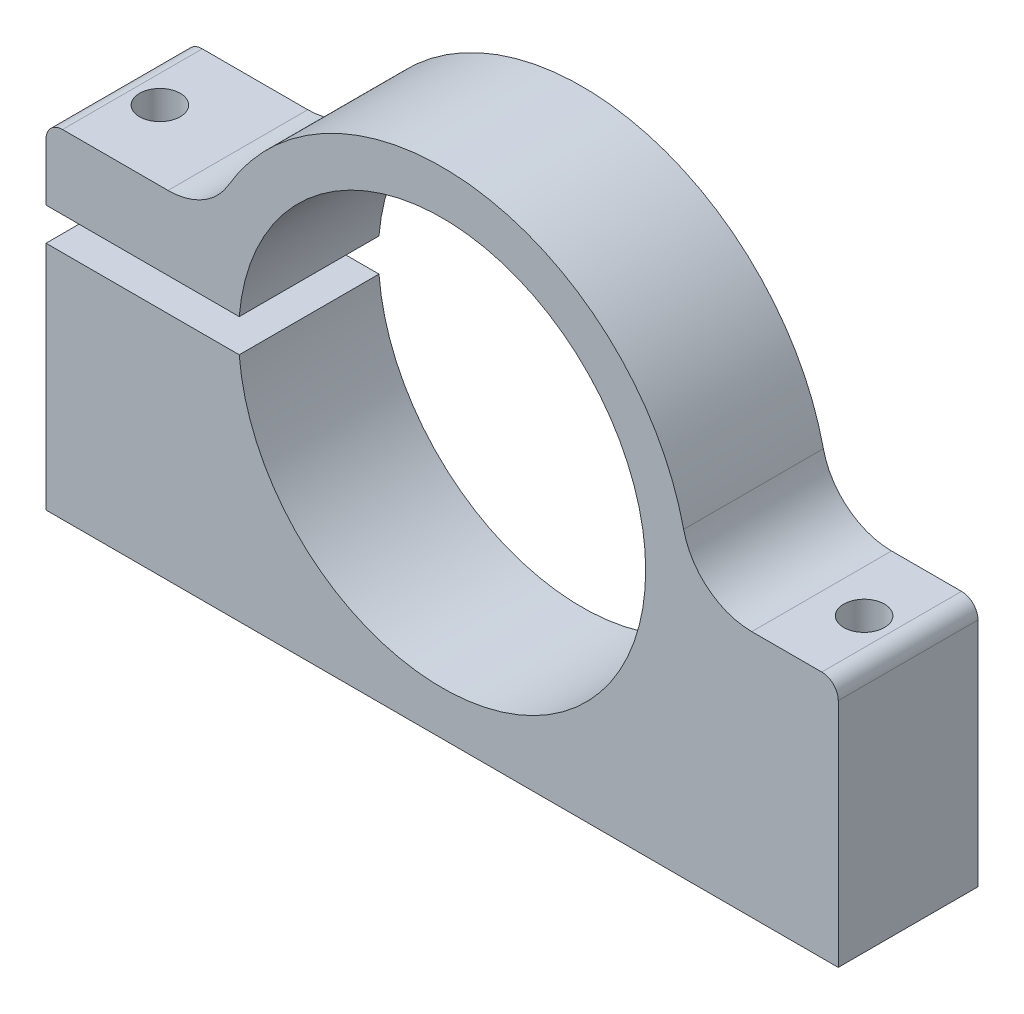
ISO-10303-21;
HEADER;
FILE_DESCRIPTION(('STEP AP214'),'2;1');
FILE_NAME('part.step','',(''),(''),'','','');
FILE_SCHEMA(('AUTOMOTIVE_DESIGN { 1 0 10303 214 1 1 1 1 }'));
ENDSEC;
DATA;
#1=APPLICATION_CONTEXT('core data for automotive mechanical design processes');
#2=APPLICATION_PROTOCOL_DEFINITION('international standard','automotive_design',2000,#1);
#3=PRODUCT_CONTEXT('',#1,'mechanical');
#4=PRODUCT('Part','Part','',(#3));
#5=PRODUCT_RELATED_PRODUCT_CATEGORY('part','',(#4));
#6=PRODUCT_DEFINITION_FORMATION('','',#4);
#7=PRODUCT_DEFINITION_CONTEXT('part definition',#1,'design');
#8=PRODUCT_DEFINITION('design','',#6,#7);
#9=PRODUCT_DEFINITION_SHAPE('','',#8);
#10=(LENGTH_UNIT() NAMED_UNIT(*) SI_UNIT(.MILLI.,.METRE.));
#11=(NAMED_UNIT(*) PLANE_ANGLE_UNIT() SI_UNIT($,.RADIAN.));
#12=(NAMED_UNIT(*) SI_UNIT($,.STERADIAN.) SOLID_ANGLE_UNIT());
#13=UNCERTAINTY_MEASURE_WITH_UNIT(LENGTH_MEASURE(1.E-05),#10,'distance_accuracy_value','');
#14=(GEOMETRIC_REPRESENTATION_CONTEXT(3) GLOBAL_UNCERTAINTY_ASSIGNED_CONTEXT((#13)) GLOBAL_UNIT_ASSIGNED_CONTEXT((#10,
#11,#12)) REPRESENTATION_CONTEXT('',''));
#15=CARTESIAN_POINT('',(0.,0.,0.));
#16=DIRECTION('',(0.,0.,1.));
#17=DIRECTION('',(1.,0.,0.));
#18=AXIS2_PLACEMENT_3D('',#15,#16,#17);
#19=CARTESIAN_POINT('',(-36.,8.2,-6.35));
#20=DIRECTION('',(-1.,0.,0.));
#21=DIRECTION('',(0.,0.,1.));
#22=AXIS2_PLACEMENT_3D('',#19,#20,#21);
#23=PLANE('',#22);
#24=DIRECTION('',(0.,0.,-1.));
#25=VECTOR('',#24,1.);
#26=CARTESIAN_POINT('',(-36.,-1.5,6.35));
#27=LINE('',#26,#25);
#28=CARTESIAN_POINT('',(-36.,-1.5,6.35));
#29=VERTEX_POINT('',#28);
#30=CARTESIAN_POINT('',(-36.,-1.5,-6.35));
#31=VERTEX_POINT('',#30);
#32=EDGE_CURVE('E142',#29,#31,#27,.T.);
#33=ORIENTED_EDGE('',*,*,#32,.T.);
#34=DIRECTION('',(0.,-1.,0.));
#35=VECTOR('',#34,1.);
#36=CARTESIAN_POINT('',(-36.,8.2,-6.35));
#37=LINE('',#36,#35);
#38=CARTESIAN_POINT('',(-36.,-22.5,-6.35));
#39=VERTEX_POINT('',#38);
#40=EDGE_CURVE('E179',#31,#39,#37,.T.);
#41=ORIENTED_EDGE('',*,*,#40,.T.);
#42=DIRECTION('',(0.,0.,1.));
#43=VECTOR('',#42,1.);
#44=CARTESIAN_POINT('',(-36.,-22.5,-6.35));
#45=LINE('',#44,#43);
#46=CARTESIAN_POINT('',(-36.,-22.5,6.35));
#47=VERTEX_POINT('',#46);
#48=EDGE_CURVE('E190',#39,#47,#45,.T.);
#49=ORIENTED_EDGE('',*,*,#48,.T.);
#50=DIRECTION('',(0.,-1.,0.));
#51=VECTOR('',#50,1.);
#52=CARTESIAN_POINT('',(-36.,8.2,6.35));
#53=LINE('',#52,#51);
#54=EDGE_CURVE('E194',#29,#47,#53,.T.);
#55=ORIENTED_EDGE('',*,*,#54,.F.);
#56=EDGE_LOOP('',(#33,#41,#49,#55));
#57=FACE_BOUND('',#56,.T.);
#58=ADVANCED_FACE('F32',(#57),#23,.T.);
#59=CARTESIAN_POINT('',(0.,0.,-6.35));
#60=DIRECTION('',(0.,0.,1.));
#61=DIRECTION('',(1.,0.,0.));
#62=AXIS2_PLACEMENT_3D('',#59,#60,#61);
#63=CYLINDRICAL_SURFACE('',#62,22.5);
#64=CARTESIAN_POINT('',(0.,0.,-6.35));
#65=DIRECTION('',(0.,0.,1.));
#66=DIRECTION('',(1.,0.,0.));
#67=AXIS2_PLACEMENT_3D('',#64,#65,#66);
#68=CIRCLE('',#67,22.5);
#69=CARTESIAN_POINT('',(21.9482193267301,4.95233968804159,-6.35));
#70=VERTEX_POINT('',#69);
#71=CARTESIAN_POINT('',(-19.4289613398529,11.3474870017331,-6.35));
#72=VERTEX_POINT('',#71);
#73=EDGE_CURVE('E173',#70,#72,#68,.T.);
#74=ORIENTED_EDGE('',*,*,#73,.T.);
#75=DIRECTION('',(0.,0.,1.));
#76=VECTOR('',#75,1.);
#77=CARTESIAN_POINT('',(-19.4289613398529,11.3474870017331,-6.35));
#78=LINE('',#77,#76);
#79=CARTESIAN_POINT('',(-19.4289613398529,11.3474870017331,6.35));
#80=VERTEX_POINT('',#79);
#81=EDGE_CURVE('E230',#72,#80,#78,.T.);
#82=ORIENTED_EDGE('',*,*,#81,.T.);
#83=CARTESIAN_POINT('',(0.,0.,6.35));
#84=DIRECTION('',(0.,0.,1.));
#85=DIRECTION('',(1.,0.,0.));
#86=AXIS2_PLACEMENT_3D('',#83,#84,#85);
#87=CIRCLE('',#86,22.5);
#88=CARTESIAN_POINT('',(21.9482193267301,4.95233968804159,6.35));
#89=VERTEX_POINT('',#88);
#90=EDGE_CURVE('E170',#89,#80,#87,.T.);
#91=ORIENTED_EDGE('',*,*,#90,.F.);
#92=DIRECTION('',(0.,0.,1.));
#93=VECTOR('',#92,1.);
#94=CARTESIAN_POINT('',(21.9482193267301,4.9523396880416,-6.35));
#95=LINE('',#94,#93);
#96=EDGE_CURVE('E228',#89,#70,#95,.F.);
#97=ORIENTED_EDGE('',*,*,#96,.T.);
#98=EDGE_LOOP('',(#74,#82,#91,#97));
#99=FACE_BOUND('',#98,.T.);
#100=ADVANCED_FACE('F243',(#99),#63,.T.);
#101=CARTESIAN_POINT('',(36.,0.,-6.35));
#102=DIRECTION('',(0.,1.,0.));
#103=DIRECTION('',(0.,0.,1.));
#104=AXIS2_PLACEMENT_3D('',#101,#102,#103);
#105=PLANE('',#104);
#106=CARTESIAN_POINT('',(32.,0.,0.));
#107=DIRECTION('',(0.,1.,0.));
#108=DIRECTION('',(0.,0.,1.));
#109=AXIS2_PLACEMENT_3D('',#106,#107,#108);
#110=CIRCLE('',#109,1.84999999999999);
#111=CARTESIAN_POINT('',(32.,0.,1.84999999999999));
#112=VERTEX_POINT('',#111);
#113=EDGE_CURVE('E308',#112,#112,#110,.T.);
#114=ORIENTED_EDGE('',*,*,#113,.F.);
#115=EDGE_LOOP('',(#114));
#116=FACE_BOUND('',#115,.T.);
#117=DIRECTION('',(-1.,0.,0.));
#118=VECTOR('',#117,1.);
#119=CARTESIAN_POINT('',(36.,0.,-6.35));
#120=LINE('',#119,#118);
#121=CARTESIAN_POINT('',(34.5,0.,-6.35));
#122=VERTEX_POINT('',#121);
#123=CARTESIAN_POINT('',(28.1424945589406,0.,-6.35));
#124=VERTEX_POINT('',#123);
#125=EDGE_CURVE('E188',#122,#124,#120,.T.);
#126=ORIENTED_EDGE('',*,*,#125,.T.);
#127=DIRECTION('',(0.,0.,-1.));
#128=VECTOR('',#127,1.);
#129=CARTESIAN_POINT('',(28.1424945589406,0.,6.35));
#130=LINE('',#129,#128);
#131=CARTESIAN_POINT('',(28.1424945589406,0.,6.35));
#132=VERTEX_POINT('',#131);
#133=EDGE_CURVE('E235',#124,#132,#130,.F.);
#134=ORIENTED_EDGE('',*,*,#133,.T.);
#135=DIRECTION('',(-1.,0.,0.));
#136=VECTOR('',#135,1.);
#137=CARTESIAN_POINT('',(36.,0.,6.35));
#138=LINE('',#137,#136);
#139=CARTESIAN_POINT('',(34.5,0.,6.35));
#140=VERTEX_POINT('',#139);
#141=EDGE_CURVE('E177',#140,#132,#138,.T.);
#142=ORIENTED_EDGE('',*,*,#141,.F.);
#143=DIRECTION('',(0.,0.,1.));
#144=VECTOR('',#143,1.);
#145=CARTESIAN_POINT('',(34.5,0.,-6.35));
#146=LINE('',#145,#144);
#147=EDGE_CURVE('E226',#140,#122,#146,.F.);
#148=ORIENTED_EDGE('',*,*,#147,.T.);
#149=EDGE_LOOP('',(#126,#134,#142,#148));
#150=FACE_BOUND('',#149,.T.);
#151=ADVANCED_FACE('F246',(#116,#150),#105,.T.);
#152=CARTESIAN_POINT('',(36.,-22.5,-6.35));
#153=DIRECTION('',(1.,0.,0.));
#154=DIRECTION('',(0.,0.,-1.));
#155=AXIS2_PLACEMENT_3D('',#152,#153,#154);
#156=PLANE('',#155);
#157=DIRECTION('',(0.,1.,0.));
#158=VECTOR('',#157,1.);
#159=CARTESIAN_POINT('',(36.,-22.5,-6.35));
#160=LINE('',#159,#158);
#161=CARTESIAN_POINT('',(36.,-22.5,-6.35));
#162=VERTEX_POINT('',#161);
#163=CARTESIAN_POINT('',(36.,-1.50000000000001,-6.35));
#164=VERTEX_POINT('',#163);
#165=EDGE_CURVE('E185',#162,#164,#160,.T.);
#166=ORIENTED_EDGE('',*,*,#165,.T.);
#167=DIRECTION('',(0.,0.,1.));
#168=VECTOR('',#167,1.);
#169=CARTESIAN_POINT('',(36.,-1.5,-6.35));
#170=LINE('',#169,#168);
#171=CARTESIAN_POINT('',(36.,-1.50000000000001,6.35));
#172=VERTEX_POINT('',#171);
#173=EDGE_CURVE('E223',#164,#172,#170,.T.);
#174=ORIENTED_EDGE('',*,*,#173,.T.);
#175=DIRECTION('',(0.,1.,0.));
#176=VECTOR('',#175,1.);
#177=CARTESIAN_POINT('',(36.,-22.5,6.35));
#178=LINE('',#177,#176);
#179=CARTESIAN_POINT('',(36.,-22.5,6.35));
#180=VERTEX_POINT('',#179);
#181=EDGE_CURVE('E200',#180,#172,#178,.T.);
#182=ORIENTED_EDGE('',*,*,#181,.F.);
#183=DIRECTION('',(0.,0.,1.));
#184=VECTOR('',#183,1.);
#185=CARTESIAN_POINT('',(36.,-22.5,-6.35));
#186=LINE('',#185,#184);
#187=EDGE_CURVE('E205',#162,#180,#186,.T.);
#188=ORIENTED_EDGE('',*,*,#187,.F.);
#189=EDGE_LOOP('',(#166,#174,#182,#188));
#190=FACE_BOUND('',#189,.T.);
#191=ADVANCED_FACE('F257',(#190),#156,.T.);
#192=CARTESIAN_POINT('',(-36.,-22.5,-6.35));
#193=DIRECTION('',(0.,-1.,0.));
#194=DIRECTION('',(0.,0.,-1.));
#195=AXIS2_PLACEMENT_3D('',#192,#193,#194);
#196=PLANE('',#195);
#197=CARTESIAN_POINT('',(32.,-22.5,0.));
#198=DIRECTION('',(0.,-1.,0.));
#199=DIRECTION('',(0.,0.,-1.));
#200=AXIS2_PLACEMENT_3D('',#197,#198,#199);
#201=CIRCLE('',#200,1.84999999999999);
#202=CARTESIAN_POINT('',(32.,-22.5,-1.84999999999999));
#203=VERTEX_POINT('',#202);
#204=EDGE_CURVE('E311',#203,#203,#201,.T.);
#205=ORIENTED_EDGE('',*,*,#204,.F.);
#206=EDGE_LOOP('',(#205));
#207=FACE_BOUND('',#206,.T.);
#208=CARTESIAN_POINT('',(-32.,-22.5,0.));
#209=DIRECTION('',(0.,-1.,0.));
#210=DIRECTION('',(0.,0.,-1.));
#211=AXIS2_PLACEMENT_3D('',#208,#209,#210);
#212=CIRCLE('',#211,1.84999999999999);
#213=CARTESIAN_POINT('',(-32.,-22.5,-1.84999999999999));
#214=VERTEX_POINT('',#213);
#215=EDGE_CURVE('E305',#214,#214,#212,.T.);
#216=ORIENTED_EDGE('',*,*,#215,.F.);
#217=EDGE_LOOP('',(#216));
#218=FACE_BOUND('',#217,.T.);
#219=DIRECTION('',(1.,0.,0.));
#220=VECTOR('',#219,1.);
#221=CARTESIAN_POINT('',(-36.,-22.5,6.35));
#222=LINE('',#221,#220);
#223=EDGE_CURVE('E197',#47,#180,#222,.T.);
#224=ORIENTED_EDGE('',*,*,#223,.F.);
#225=ORIENTED_EDGE('',*,*,#48,.F.);
#226=DIRECTION('',(1.,0.,0.));
#227=VECTOR('',#226,1.);
#228=CARTESIAN_POINT('',(-36.,-22.5,-6.35));
#229=LINE('',#228,#227);
#230=EDGE_CURVE('E182',#39,#162,#229,.T.);
#231=ORIENTED_EDGE('',*,*,#230,.T.);
#232=ORIENTED_EDGE('',*,*,#187,.T.);
#233=EDGE_LOOP('',(#224,#225,#231,#232));
#234=FACE_BOUND('',#233,.T.);
#235=ADVANCED_FACE('F261',(#207,#218,#234),#196,.T.);
#236=CARTESIAN_POINT('',(-36.,6.7,6.35));
#237=VERTEX_POINT('',#236);
#238=CARTESIAN_POINT('',(-36.,1.5,6.35));
#239=VERTEX_POINT('',#238);
#240=EDGE_CURVE('E195',#237,#239,#53,.T.);
#241=ORIENTED_EDGE('',*,*,#240,.F.);
#242=DIRECTION('',(0.,0.,1.));
#243=VECTOR('',#242,1.);
#244=CARTESIAN_POINT('',(-36.,6.7,-6.35));
#245=LINE('',#244,#243);
#246=CARTESIAN_POINT('',(-36.,6.7,-6.35));
#247=VERTEX_POINT('',#246);
#248=EDGE_CURVE('E216',#237,#247,#245,.F.);
#249=ORIENTED_EDGE('',*,*,#248,.T.);
#250=CARTESIAN_POINT('',(-36.,1.5,-6.35));
#251=VERTEX_POINT('',#250);
#252=EDGE_CURVE('E180',#247,#251,#37,.T.);
#253=ORIENTED_EDGE('',*,*,#252,.T.);
#254=DIRECTION('',(0.,0.,-1.));
#255=VECTOR('',#254,1.);
#256=CARTESIAN_POINT('',(-36.,1.5,6.35));
#257=LINE('',#256,#255);
#258=EDGE_CURVE('E158',#239,#251,#257,.T.);
#259=ORIENTED_EDGE('',*,*,#258,.F.);
#260=EDGE_LOOP('',(#241,#249,#253,#259));
#261=FACE_BOUND('',#260,.T.);
#262=ADVANCED_FACE('F267',(#261),#23,.T.);
#263=CARTESIAN_POINT('',(-20.9525654753779,8.2,-6.35));
#264=DIRECTION('',(0.,1.,0.));
#265=DIRECTION('',(0.,0.,1.));
#266=AXIS2_PLACEMENT_3D('',#263,#264,#265);
#267=PLANE('',#266);
#268=CARTESIAN_POINT('',(-32.,8.2,0.));
#269=DIRECTION('',(0.,1.,0.));
#270=DIRECTION('',(0.,0.,1.));
#271=AXIS2_PLACEMENT_3D('',#268,#269,#270);
#272=CIRCLE('',#271,1.84999999999999);
#273=CARTESIAN_POINT('',(-32.,8.2,1.84999999999999));
#274=VERTEX_POINT('',#273);
#275=EDGE_CURVE('E299',#274,#274,#272,.T.);
#276=ORIENTED_EDGE('',*,*,#275,.F.);
#277=EDGE_LOOP('',(#276));
#278=FACE_BOUND('',#277,.T.);
#279=DIRECTION('',(-1.,0.,0.));
#280=VECTOR('',#279,1.);
#281=CARTESIAN_POINT('',(-20.9525654753779,8.2,6.35));
#282=LINE('',#281,#280);
#283=CARTESIAN_POINT('',(-24.9122459846558,8.2,6.35));
#284=VERTEX_POINT('',#283);
#285=CARTESIAN_POINT('',(-34.5,8.2,6.35));
#286=VERTEX_POINT('',#285);
#287=EDGE_CURVE('E192',#284,#286,#282,.T.);
#288=ORIENTED_EDGE('',*,*,#287,.F.);
#289=DIRECTION('',(0.,0.,-1.));
#290=VECTOR('',#289,1.);
#291=CARTESIAN_POINT('',(-24.9122459846558,8.2,-6.35));
#292=LINE('',#291,#290);
#293=CARTESIAN_POINT('',(-24.9122459846558,8.2,-6.35));
#294=VERTEX_POINT('',#293);
#295=EDGE_CURVE('E233',#284,#294,#292,.T.);
#296=ORIENTED_EDGE('',*,*,#295,.T.);
#297=DIRECTION('',(-1.,0.,0.));
#298=VECTOR('',#297,1.);
#299=CARTESIAN_POINT('',(-20.9525654753779,8.2,-6.35));
#300=LINE('',#299,#298);
#301=CARTESIAN_POINT('',(-34.5,8.2,-6.35));
#302=VERTEX_POINT('',#301);
#303=EDGE_CURVE('E176',#294,#302,#300,.T.);
#304=ORIENTED_EDGE('',*,*,#303,.T.);
#305=DIRECTION('',(0.,0.,1.));
#306=VECTOR('',#305,1.);
#307=CARTESIAN_POINT('',(-34.5,8.2,-6.35));
#308=LINE('',#307,#306);
#309=EDGE_CURVE('E207',#302,#286,#308,.T.);
#310=ORIENTED_EDGE('',*,*,#309,.T.);
#311=EDGE_LOOP('',(#288,#296,#304,#310));
#312=FACE_BOUND('',#311,.T.);
#313=ADVANCED_FACE('F275',(#278,#312),#267,.T.);
#314=CARTESIAN_POINT('',(0.,0.,-6.35));
#315=DIRECTION('',(0.,0.,1.));
#316=DIRECTION('',(1.,0.,0.));
#317=AXIS2_PLACEMENT_3D('',#314,#315,#316);
#318=PLANE('',#317);
#319=ORIENTED_EDGE('',*,*,#252,.F.);
#320=CARTESIAN_POINT('',(-34.5,6.7,-6.35));
#321=DIRECTION('',(0.,0.,1.));
#322=DIRECTION('',(1.,0.,0.));
#323=AXIS2_PLACEMENT_3D('',#320,#321,#322);
#324=CIRCLE('',#323,1.5);
#325=EDGE_CURVE('E220',#247,#302,#324,.F.);
#326=ORIENTED_EDGE('',*,*,#325,.T.);
#327=ORIENTED_EDGE('',*,*,#303,.F.);
#328=CARTESIAN_POINT('',(-24.9122459846558,14.55,-6.35));
#329=DIRECTION('',(0.,0.,1.));
#330=DIRECTION('',(1.,0.,0.));
#331=AXIS2_PLACEMENT_3D('',#328,#329,#330);
#332=CIRCLE('',#331,6.35);
#333=EDGE_CURVE('E239',#294,#72,#332,.T.);
#334=ORIENTED_EDGE('',*,*,#333,.T.);
#335=ORIENTED_EDGE('',*,*,#73,.F.);
#336=CARTESIAN_POINT('',(28.1424945589406,6.35,-6.35));
#337=DIRECTION('',(0.,0.,1.));
#338=DIRECTION('',(1.,0.,0.));
#339=AXIS2_PLACEMENT_3D('',#336,#337,#338);
#340=CIRCLE('',#339,6.35);
#341=EDGE_CURVE('E11',#70,#124,#340,.T.);
#342=ORIENTED_EDGE('',*,*,#341,.T.);
#343=ORIENTED_EDGE('',*,*,#125,.F.);
#344=CARTESIAN_POINT('',(34.5,-1.5,-6.35));
#345=DIRECTION('',(0.,0.,1.));
#346=DIRECTION('',(1.,0.,0.));
#347=AXIS2_PLACEMENT_3D('',#344,#345,#346);
#348=CIRCLE('',#347,1.5);
#349=EDGE_CURVE('E218',#122,#164,#348,.F.);
#350=ORIENTED_EDGE('',*,*,#349,.T.);
#351=ORIENTED_EDGE('',*,*,#165,.F.);
#352=ORIENTED_EDGE('',*,*,#230,.F.);
#353=ORIENTED_EDGE('',*,*,#40,.F.);
#354=DIRECTION('',(-1.,0.,0.));
#355=VECTOR('',#354,1.);
#356=CARTESIAN_POINT('',(-18.4390889145858,-1.49999999999983,-6.35));
#357=LINE('',#356,#355);
#358=CARTESIAN_POINT('',(-18.4390889145858,-1.49999999999983,-6.35));
#359=VERTEX_POINT('',#358);
#360=EDGE_CURVE('E162',#359,#31,#357,.T.);
#361=ORIENTED_EDGE('',*,*,#360,.F.);
#362=CARTESIAN_POINT('',(0.,0.,-6.35));
#363=DIRECTION('',(0.,0.,1.));
#364=DIRECTION('',(1.,0.,0.));
#365=AXIS2_PLACEMENT_3D('',#362,#363,#364);
#366=CIRCLE('',#365,18.5);
#367=CARTESIAN_POINT('',(-18.4390889145858,1.49999999999983,-6.35));
#368=VERTEX_POINT('',#367);
#369=EDGE_CURVE('E138',#359,#368,#366,.T.);
#370=ORIENTED_EDGE('',*,*,#369,.T.);
#371=DIRECTION('',(1.,0.,0.));
#372=VECTOR('',#371,1.);
#373=CARTESIAN_POINT('',(-36.,1.5,-6.35));
#374=LINE('',#373,#372);
#375=EDGE_CURVE('E166',#251,#368,#374,.T.);
#376=ORIENTED_EDGE('',*,*,#375,.F.);
#377=EDGE_LOOP('',(#319,#326,#327,#334,#335,#342,#343,#350,#351,#352,#353,#361,#370,#376));
#378=FACE_BOUND('',#377,.T.);
#379=ADVANCED_FACE('F250',(#378),#318,.F.);
#380=CARTESIAN_POINT('',(0.,0.,6.35));
#381=DIRECTION('',(0.,0.,1.));
#382=DIRECTION('',(1.,0.,0.));
#383=AXIS2_PLACEMENT_3D('',#380,#381,#382);
#384=PLANE('',#383);
#385=ORIENTED_EDGE('',*,*,#90,.T.);
#386=CARTESIAN_POINT('',(-24.9122459846558,14.55,6.35));
#387=DIRECTION('',(0.,0.,1.));
#388=DIRECTION('',(1.,0.,0.));
#389=AXIS2_PLACEMENT_3D('',#386,#387,#388);
#390=CIRCLE('',#389,6.35);
#391=EDGE_CURVE('E237',#80,#284,#390,.F.);
#392=ORIENTED_EDGE('',*,*,#391,.T.);
#393=ORIENTED_EDGE('',*,*,#287,.T.);
#394=CARTESIAN_POINT('',(-34.5,6.7,6.35));
#395=DIRECTION('',(0.,0.,1.));
#396=DIRECTION('',(1.,0.,0.));
#397=AXIS2_PLACEMENT_3D('',#394,#395,#396);
#398=CIRCLE('',#397,1.5);
#399=EDGE_CURVE('E214',#286,#237,#398,.T.);
#400=ORIENTED_EDGE('',*,*,#399,.T.);
#401=ORIENTED_EDGE('',*,*,#240,.T.);
#402=DIRECTION('',(1.,0.,0.));
#403=VECTOR('',#402,1.);
#404=CARTESIAN_POINT('',(-36.,1.5,6.35));
#405=LINE('',#404,#403);
#406=CARTESIAN_POINT('',(-18.4390889145858,1.49999999999983,6.35));
#407=VERTEX_POINT('',#406);
#408=EDGE_CURVE('E153',#239,#407,#405,.T.);
#409=ORIENTED_EDGE('',*,*,#408,.T.);
#410=CARTESIAN_POINT('',(0.,0.,6.35));
#411=DIRECTION('',(0.,0.,1.));
#412=DIRECTION('',(1.,0.,0.));
#413=AXIS2_PLACEMENT_3D('',#410,#411,#412);
#414=CIRCLE('',#413,18.5);
#415=CARTESIAN_POINT('',(-18.4390889145858,-1.49999999999983,6.35));
#416=VERTEX_POINT('',#415);
#417=EDGE_CURVE('E135',#416,#407,#414,.T.);
#418=ORIENTED_EDGE('',*,*,#417,.F.);
#419=DIRECTION('',(-1.,0.,0.));
#420=VECTOR('',#419,1.);
#421=CARTESIAN_POINT('',(-18.4390889145858,-1.49999999999983,6.35));
#422=LINE('',#421,#420);
#423=EDGE_CURVE('E150',#416,#29,#422,.T.);
#424=ORIENTED_EDGE('',*,*,#423,.T.);
#425=ORIENTED_EDGE('',*,*,#54,.T.);
#426=ORIENTED_EDGE('',*,*,#223,.T.);
#427=ORIENTED_EDGE('',*,*,#181,.T.);
#428=CARTESIAN_POINT('',(34.5,-1.5,6.35));
#429=DIRECTION('',(0.,0.,1.));
#430=DIRECTION('',(1.,0.,0.));
#431=AXIS2_PLACEMENT_3D('',#428,#429,#430);
#432=CIRCLE('',#431,1.5);
#433=EDGE_CURVE('E212',#172,#140,#432,.T.);
#434=ORIENTED_EDGE('',*,*,#433,.T.);
#435=ORIENTED_EDGE('',*,*,#141,.T.);
#436=CARTESIAN_POINT('',(28.1424945589406,6.35,6.35));
#437=DIRECTION('',(0.,0.,1.));
#438=DIRECTION('',(1.,0.,0.));
#439=AXIS2_PLACEMENT_3D('',#436,#437,#438);
#440=CIRCLE('',#439,6.35);
#441=EDGE_CURVE('E40',#132,#89,#440,.F.);
#442=ORIENTED_EDGE('',*,*,#441,.T.);
#443=EDGE_LOOP('',(#385,#392,#393,#400,#401,#409,#418,#424,#425,#426,#427,#434,#435,#442));
#444=FACE_BOUND('',#443,.T.);
#445=ADVANCED_FACE('F149',(#444),#384,.T.);
#446=CARTESIAN_POINT('',(-18.4390889145858,-1.49999999999983,6.35));
#447=DIRECTION('',(0.,-1.,0.));
#448=DIRECTION('',(1.,0.,0.));
#449=AXIS2_PLACEMENT_3D('',#446,#447,#448);
#450=PLANE('',#449);
#451=CARTESIAN_POINT('',(-32.,-1.49999999999996,0.));
#452=DIRECTION('',(0.,-1.,0.));
#453=DIRECTION('',(1.,0.,0.));
#454=AXIS2_PLACEMENT_3D('',#451,#452,#453);
#455=CIRCLE('',#454,1.84999999999999);
#456=CARTESIAN_POINT('',(-30.15,-1.49999999999994,0.));
#457=VERTEX_POINT('',#456);
#458=EDGE_CURVE('E302',#457,#457,#455,.T.);
#459=ORIENTED_EDGE('',*,*,#458,.T.);
#460=EDGE_LOOP('',(#459));
#461=FACE_BOUND('',#460,.T.);
#462=ORIENTED_EDGE('',*,*,#360,.T.);
#463=ORIENTED_EDGE('',*,*,#32,.F.);
#464=ORIENTED_EDGE('',*,*,#423,.F.);
#465=DIRECTION('',(0.,0.,-1.));
#466=VECTOR('',#465,1.);
#467=CARTESIAN_POINT('',(-18.4390889145858,-1.49999999999983,6.35));
#468=LINE('',#467,#466);
#469=EDGE_CURVE('E132',#416,#359,#468,.T.);
#470=ORIENTED_EDGE('',*,*,#469,.T.);
#471=EDGE_LOOP('',(#462,#463,#464,#470));
#472=FACE_BOUND('',#471,.T.);
#473=ADVANCED_FACE('F156',(#461,#472),#450,.F.);
#474=CARTESIAN_POINT('',(-36.,1.5,6.35));
#475=DIRECTION('',(0.,1.,0.));
#476=DIRECTION('',(-1.,0.,0.));
#477=AXIS2_PLACEMENT_3D('',#474,#475,#476);
#478=PLANE('',#477);
#479=CARTESIAN_POINT('',(-32.,1.49999999999996,0.));
#480=DIRECTION('',(0.,1.,0.));
#481=DIRECTION('',(-1.,0.,0.));
#482=AXIS2_PLACEMENT_3D('',#479,#480,#481);
#483=CIRCLE('',#482,1.84999999999999);
#484=CARTESIAN_POINT('',(-33.85,1.49999999999998,0.));
#485=VERTEX_POINT('',#484);
#486=EDGE_CURVE('E154',#485,#485,#483,.T.);
#487=ORIENTED_EDGE('',*,*,#486,.T.);
#488=EDGE_LOOP('',(#487));
#489=FACE_BOUND('',#488,.T.);
#490=ORIENTED_EDGE('',*,*,#375,.T.);
#491=DIRECTION('',(0.,0.,-1.));
#492=VECTOR('',#491,1.);
#493=CARTESIAN_POINT('',(-18.4390889145858,1.49999999999983,6.35));
#494=LINE('',#493,#492);
#495=EDGE_CURVE('E143',#407,#368,#494,.T.);
#496=ORIENTED_EDGE('',*,*,#495,.F.);
#497=ORIENTED_EDGE('',*,*,#408,.F.);
#498=ORIENTED_EDGE('',*,*,#258,.T.);
#499=EDGE_LOOP('',(#490,#496,#497,#498));
#500=FACE_BOUND('',#499,.T.);
#501=ADVANCED_FACE('F295',(#489,#500),#478,.F.);
#502=CARTESIAN_POINT('',(0.,0.,-6.35));
#503=DIRECTION('',(0.,0.,1.));
#504=DIRECTION('',(1.,0.,0.));
#505=AXIS2_PLACEMENT_3D('',#502,#503,#504);
#506=CYLINDRICAL_SURFACE('',#505,18.5);
#507=ORIENTED_EDGE('',*,*,#417,.T.);
#508=ORIENTED_EDGE('',*,*,#495,.T.);
#509=ORIENTED_EDGE('',*,*,#369,.F.);
#510=ORIENTED_EDGE('',*,*,#469,.F.);
#511=EDGE_LOOP('',(#507,#508,#509,#510));
#512=FACE_BOUND('',#511,.T.);
#513=ADVANCED_FACE('F134',(#512),#506,.F.);
#514=CARTESIAN_POINT('',(-32.,8.2,0.));
#515=DIRECTION('',(0.,1.,0.));
#516=DIRECTION('',(0.,0.,1.));
#517=AXIS2_PLACEMENT_3D('',#514,#515,#516);
#518=CYLINDRICAL_SURFACE('',#517,1.84999999999999);
#519=ORIENTED_EDGE('',*,*,#486,.F.);
#520=EDGE_LOOP('',(#519));
#521=FACE_BOUND('',#520,.T.);
#522=ORIENTED_EDGE('',*,*,#275,.T.);
#523=EDGE_LOOP('',(#522));
#524=FACE_BOUND('',#523,.T.);
#525=ADVANCED_FACE('F322',(#521,#524),#518,.F.);
#526=CARTESIAN_POINT('',(-32.,-22.5,0.));
#527=DIRECTION('',(0.,-1.,0.));
#528=DIRECTION('',(0.,0.,-1.));
#529=AXIS2_PLACEMENT_3D('',#526,#527,#528);
#530=CYLINDRICAL_SURFACE('',#529,1.84999999999999);
#531=ORIENTED_EDGE('',*,*,#215,.T.);
#532=EDGE_LOOP('',(#531));
#533=FACE_BOUND('',#532,.T.);
#534=ORIENTED_EDGE('',*,*,#458,.F.);
#535=EDGE_LOOP('',(#534));
#536=FACE_BOUND('',#535,.T.);
#537=ADVANCED_FACE('F319',(#533,#536),#530,.F.);
#538=CARTESIAN_POINT('',(32.,-22.5,0.));
#539=DIRECTION('',(0.,-1.,0.));
#540=DIRECTION('',(0.,0.,-1.));
#541=AXIS2_PLACEMENT_3D('',#538,#539,#540);
#542=CYLINDRICAL_SURFACE('',#541,1.84999999999999);
#543=ORIENTED_EDGE('',*,*,#113,.T.);
#544=EDGE_LOOP('',(#543));
#545=FACE_BOUND('',#544,.T.);
#546=ORIENTED_EDGE('',*,*,#204,.T.);
#547=EDGE_LOOP('',(#546));
#548=FACE_BOUND('',#547,.T.);
#549=ADVANCED_FACE('F315',(#545,#548),#542,.F.);
#550=CARTESIAN_POINT('',(-34.5,6.7,-6.35));
#551=DIRECTION('',(0.,0.,1.));
#552=DIRECTION('',(1.,0.,0.));
#553=AXIS2_PLACEMENT_3D('',#550,#551,#552);
#554=CYLINDRICAL_SURFACE('',#553,1.5);
#555=ORIENTED_EDGE('',*,*,#325,.F.);
#556=ORIENTED_EDGE('',*,*,#248,.F.);
#557=ORIENTED_EDGE('',*,*,#399,.F.);
#558=ORIENTED_EDGE('',*,*,#309,.F.);
#559=EDGE_LOOP('',(#555,#556,#557,#558));
#560=FACE_BOUND('',#559,.T.);
#561=ADVANCED_FACE('F289',(#560),#554,.T.);
#562=CARTESIAN_POINT('',(34.5,-1.5,-6.35));
#563=DIRECTION('',(0.,0.,1.));
#564=DIRECTION('',(1.,0.,0.));
#565=AXIS2_PLACEMENT_3D('',#562,#563,#564);
#566=CYLINDRICAL_SURFACE('',#565,1.5);
#567=ORIENTED_EDGE('',*,*,#349,.F.);
#568=ORIENTED_EDGE('',*,*,#147,.F.);
#569=ORIENTED_EDGE('',*,*,#433,.F.);
#570=ORIENTED_EDGE('',*,*,#173,.F.);
#571=EDGE_LOOP('',(#567,#568,#569,#570));
#572=FACE_BOUND('',#571,.T.);
#573=ADVANCED_FACE('F254',(#572),#566,.T.);
#574=CARTESIAN_POINT('',(-24.9122459846558,14.55,-6.35));
#575=DIRECTION('',(0.,0.,1.));
#576=DIRECTION('',(1.,0.,0.));
#577=AXIS2_PLACEMENT_3D('',#574,#575,#576);
#578=CYLINDRICAL_SURFACE('',#577,6.35);
#579=ORIENTED_EDGE('',*,*,#333,.F.);
#580=ORIENTED_EDGE('',*,*,#295,.F.);
#581=ORIENTED_EDGE('',*,*,#391,.F.);
#582=ORIENTED_EDGE('',*,*,#81,.F.);
#583=EDGE_LOOP('',(#579,#580,#581,#582));
#584=FACE_BOUND('',#583,.T.);
#585=ADVANCED_FACE('F381',(#584),#578,.F.);
#586=CARTESIAN_POINT('',(28.1424945589406,6.35,-6.35));
#587=DIRECTION('',(0.,0.,1.));
#588=DIRECTION('',(1.,0.,0.));
#589=AXIS2_PLACEMENT_3D('',#586,#587,#588);
#590=CYLINDRICAL_SURFACE('',#589,6.35);
#591=ORIENTED_EDGE('',*,*,#341,.F.);
#592=ORIENTED_EDGE('',*,*,#96,.F.);
#593=ORIENTED_EDGE('',*,*,#441,.F.);
#594=ORIENTED_EDGE('',*,*,#133,.F.);
#595=EDGE_LOOP('',(#591,#592,#593,#594));
#596=FACE_BOUND('',#595,.T.);
#597=ADVANCED_FACE('F34',(#596),#590,.F.);
#598=CLOSED_SHELL('',(#58,#100,#151,#191,#235,#262,#313,#379,#445,#473,#501,#513,#525,#537,#549,
#561,#573,#585,#597));
#599=MANIFOLD_SOLID_BREP('B2',#598);
#600=ADVANCED_BREP_SHAPE_REPRESENTATION('',(#18,#599),#14);
#601=SHAPE_DEFINITION_REPRESENTATION(#9,#600);
ENDSEC;
END-ISO-10303-21;
